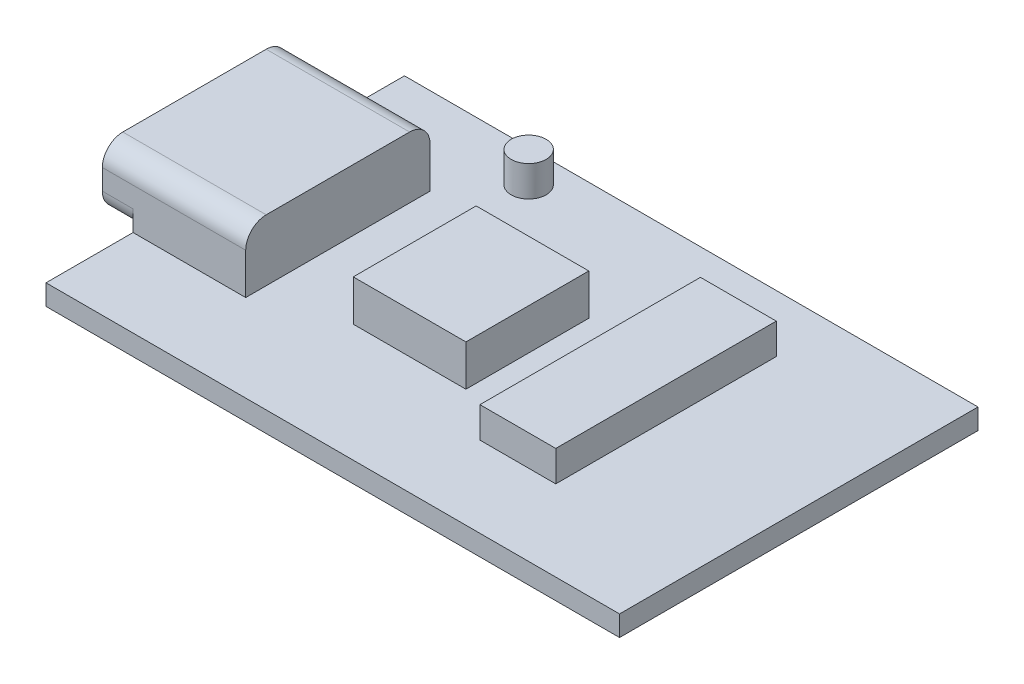
ISO-10303-21;
HEADER;
FILE_DESCRIPTION(('STEP AP214'),'2;1');
FILE_NAME('part.step','',(''),(''),'','','');
FILE_SCHEMA(('AUTOMOTIVE_DESIGN { 1 0 10303 214 1 1 1 1 }'));
ENDSEC;
DATA;
#1=APPLICATION_CONTEXT('core data for automotive mechanical design processes');
#2=APPLICATION_PROTOCOL_DEFINITION('international standard','automotive_design',2000,#1);
#3=PRODUCT_CONTEXT('',#1,'mechanical');
#4=PRODUCT('Part','Part','',(#3));
#5=PRODUCT_RELATED_PRODUCT_CATEGORY('part','',(#4));
#6=PRODUCT_DEFINITION_FORMATION('','',#4);
#7=PRODUCT_DEFINITION_CONTEXT('part definition',#1,'design');
#8=PRODUCT_DEFINITION('design','',#6,#7);
#9=PRODUCT_DEFINITION_SHAPE('','',#8);
#10=(LENGTH_UNIT() NAMED_UNIT(*) SI_UNIT(.MILLI.,.METRE.));
#11=(NAMED_UNIT(*) PLANE_ANGLE_UNIT() SI_UNIT($,.RADIAN.));
#12=(NAMED_UNIT(*) SI_UNIT($,.STERADIAN.) SOLID_ANGLE_UNIT());
#13=UNCERTAINTY_MEASURE_WITH_UNIT(LENGTH_MEASURE(1.E-05),#10,'distance_accuracy_value','');
#14=(GEOMETRIC_REPRESENTATION_CONTEXT(3) GLOBAL_UNCERTAINTY_ASSIGNED_CONTEXT((#13)) GLOBAL_UNIT_ASSIGNED_CONTEXT((#10,
#11,#12)) REPRESENTATION_CONTEXT('',''));
#15=CARTESIAN_POINT('',(0.,0.,0.));
#16=DIRECTION('',(0.,0.,1.));
#17=DIRECTION('',(1.,0.,0.));
#18=AXIS2_PLACEMENT_3D('',#15,#16,#17);
#19=CARTESIAN_POINT('',(0.,1.,0.));
#20=DIRECTION('',(0.,-1.,0.));
#21=DIRECTION('',(0.,0.,-1.));
#22=AXIS2_PLACEMENT_3D('',#19,#20,#21);
#23=PLANE('',#22);
#24=CARTESIAN_POINT('',(-6.36026661886858,1.,-7.17438545371021));
#25=DIRECTION('',(0.,-1.,0.));
#26=DIRECTION('',(0.,0.,-1.));
#27=AXIS2_PLACEMENT_3D('',#24,#25,#26);
#28=CIRCLE('',#27,0.85257989743637);
#29=CARTESIAN_POINT('',(-6.36026661886858,1.,-8.02696535114658));
#30=VERTEX_POINT('',#29);
#31=EDGE_CURVE('E11',#30,#30,#28,.F.);
#32=ORIENTED_EDGE('',*,*,#31,.F.);
#33=EDGE_LOOP('',(#32));
#34=FACE_BOUND('',#33,.T.);
#35=DIRECTION('',(0.,0.,1.));
#36=VECTOR('',#35,1.);
#37=CARTESIAN_POINT('',(-4.75,1.,3.));
#38=LINE('',#37,#36);
#39=CARTESIAN_POINT('',(-4.75,1.,-3.));
#40=VERTEX_POINT('',#39);
#41=CARTESIAN_POINT('',(-4.75,1.,3.));
#42=VERTEX_POINT('',#41);
#43=EDGE_CURVE('E209',#40,#42,#38,.T.);
#44=ORIENTED_EDGE('',*,*,#43,.F.);
#45=DIRECTION('',(-1.,0.,0.));
#46=VECTOR('',#45,1.);
#47=CARTESIAN_POINT('',(0.75,1.,-3.));
#48=LINE('',#47,#46);
#49=CARTESIAN_POINT('',(0.75,1.,-3.));
#50=VERTEX_POINT('',#49);
#51=EDGE_CURVE('E222',#50,#40,#48,.T.);
#52=ORIENTED_EDGE('',*,*,#51,.F.);
#53=DIRECTION('',(0.,0.,-1.));
#54=VECTOR('',#53,1.);
#55=CARTESIAN_POINT('',(0.75,1.,3.));
#56=LINE('',#55,#54);
#57=CARTESIAN_POINT('',(0.75,1.,3.));
#58=VERTEX_POINT('',#57);
#59=EDGE_CURVE('E231',#58,#50,#56,.T.);
#60=ORIENTED_EDGE('',*,*,#59,.F.);
#61=DIRECTION('',(1.,0.,0.));
#62=VECTOR('',#61,1.);
#63=CARTESIAN_POINT('',(0.75,1.,3.));
#64=LINE('',#63,#62);
#65=EDGE_CURVE('E212',#42,#58,#64,.T.);
#66=ORIENTED_EDGE('',*,*,#65,.F.);
#67=EDGE_LOOP('',(#44,#52,#60,#66));
#68=FACE_BOUND('',#67,.T.);
#69=DIRECTION('',(-1.,0.,0.));
#70=VECTOR('',#69,1.);
#71=CARTESIAN_POINT('',(-15.5,1.,-4.5));
#72=LINE('',#71,#70);
#73=CARTESIAN_POINT('',(-8.5,1.,-4.5));
#74=VERTEX_POINT('',#73);
#75=CARTESIAN_POINT('',(-14.,1.,-4.5));
#76=VERTEX_POINT('',#75);
#77=EDGE_CURVE('E252',#74,#76,#72,.T.);
#78=ORIENTED_EDGE('',*,*,#77,.F.);
#79=DIRECTION('',(0.,0.,-1.));
#80=VECTOR('',#79,1.);
#81=CARTESIAN_POINT('',(-8.5,1.,-4.5));
#82=LINE('',#81,#80);
#83=CARTESIAN_POINT('',(-8.5,1.,4.5));
#84=VERTEX_POINT('',#83);
#85=EDGE_CURVE('E258',#84,#74,#82,.T.);
#86=ORIENTED_EDGE('',*,*,#85,.F.);
#87=DIRECTION('',(1.,0.,0.));
#88=VECTOR('',#87,1.);
#89=CARTESIAN_POINT('',(-15.5,1.,4.5));
#90=LINE('',#89,#88);
#91=CARTESIAN_POINT('',(-14.,1.,4.5));
#92=VERTEX_POINT('',#91);
#93=EDGE_CURVE('E259',#92,#84,#90,.T.);
#94=ORIENTED_EDGE('',*,*,#93,.F.);
#95=DIRECTION('',(0.,0.,1.));
#96=VECTOR('',#95,1.);
#97=CARTESIAN_POINT('',(-14.,1.,-8.75));
#98=LINE('',#97,#96);
#99=CARTESIAN_POINT('',(-14.,1.,8.75));
#100=VERTEX_POINT('',#99);
#101=EDGE_CURVE('E283',#92,#100,#98,.T.);
#102=ORIENTED_EDGE('',*,*,#101,.T.);
#103=DIRECTION('',(1.,0.,0.));
#104=VECTOR('',#103,1.);
#105=CARTESIAN_POINT('',(14.,1.,8.75));
#106=LINE('',#105,#104);
#107=CARTESIAN_POINT('',(14.,1.,8.75));
#108=VERTEX_POINT('',#107);
#109=EDGE_CURVE('E281',#100,#108,#106,.T.);
#110=ORIENTED_EDGE('',*,*,#109,.T.);
#111=DIRECTION('',(0.,0.,-1.));
#112=VECTOR('',#111,1.);
#113=CARTESIAN_POINT('',(14.,1.,-8.75));
#114=LINE('',#113,#112);
#115=CARTESIAN_POINT('',(14.,1.,-8.75));
#116=VERTEX_POINT('',#115);
#117=EDGE_CURVE('E285',#108,#116,#114,.T.);
#118=ORIENTED_EDGE('',*,*,#117,.T.);
#119=DIRECTION('',(-1.,0.,0.));
#120=VECTOR('',#119,1.);
#121=CARTESIAN_POINT('',(14.,1.,-8.75));
#122=LINE('',#121,#120);
#123=CARTESIAN_POINT('',(-14.,1.,-8.75));
#124=VERTEX_POINT('',#123);
#125=EDGE_CURVE('E287',#116,#124,#122,.T.);
#126=ORIENTED_EDGE('',*,*,#125,.T.);
#127=EDGE_CURVE('E278',#124,#76,#98,.T.);
#128=ORIENTED_EDGE('',*,*,#127,.T.);
#129=EDGE_LOOP('',(#78,#86,#94,#102,#110,#118,#126,#128));
#130=FACE_BOUND('',#129,.T.);
#131=DIRECTION('',(0.,0.,1.));
#132=VECTOR('',#131,1.);
#133=CARTESIAN_POINT('',(3.2447448176237,1.,-5.9554008218618));
#134=LINE('',#133,#132);
#135=CARTESIAN_POINT('',(3.2447448176237,1.,-5.9554008218618));
#136=VERTEX_POINT('',#135);
#137=CARTESIAN_POINT('',(3.2447448176237,1.,4.8098489991609));
#138=VERTEX_POINT('',#137);
#139=EDGE_CURVE('E208',#136,#138,#134,.T.);
#140=ORIENTED_EDGE('',*,*,#139,.F.);
#141=DIRECTION('',(-1.,0.,0.));
#142=VECTOR('',#141,1.);
#143=CARTESIAN_POINT('',(3.2447448176237,1.,-5.9554008218618));
#144=LINE('',#143,#142);
#145=CARTESIAN_POINT('',(6.94575839865742,1.,-5.9554008218618));
#146=VERTEX_POINT('',#145);
#147=EDGE_CURVE('E205',#146,#136,#144,.T.);
#148=ORIENTED_EDGE('',*,*,#147,.F.);
#149=DIRECTION('',(0.,0.,-1.));
#150=VECTOR('',#149,1.);
#151=CARTESIAN_POINT('',(6.94575839865742,1.,-5.9554008218618));
#152=LINE('',#151,#150);
#153=CARTESIAN_POINT('',(6.94575839865742,1.,4.8098489991609));
#154=VERTEX_POINT('',#153);
#155=EDGE_CURVE('E59',#154,#146,#152,.T.);
#156=ORIENTED_EDGE('',*,*,#155,.F.);
#157=DIRECTION('',(1.,0.,0.));
#158=VECTOR('',#157,1.);
#159=CARTESIAN_POINT('',(3.2447448176237,1.,4.8098489991609));
#160=LINE('',#159,#158);
#161=EDGE_CURVE('E54',#138,#154,#160,.T.);
#162=ORIENTED_EDGE('',*,*,#161,.F.);
#163=EDGE_LOOP('',(#140,#148,#156,#162));
#164=FACE_BOUND('',#163,.T.);
#165=ADVANCED_FACE('F39',(#34,#68,#130,#164),#23,.F.);
#166=CARTESIAN_POINT('',(-14.,1.,-8.75));
#167=DIRECTION('',(1.,0.,0.));
#168=DIRECTION('',(0.,0.,-1.));
#169=AXIS2_PLACEMENT_3D('',#166,#167,#168);
#170=PLANE('',#169);
#171=DIRECTION('',(0.,0.,1.));
#172=VECTOR('',#171,1.);
#173=CARTESIAN_POINT('',(-14.,0.,-8.75));
#174=LINE('',#173,#172);
#175=CARTESIAN_POINT('',(-14.,0.,-8.75));
#176=VERTEX_POINT('',#175);
#177=CARTESIAN_POINT('',(-14.,0.,8.75));
#178=VERTEX_POINT('',#177);
#179=EDGE_CURVE('E277',#176,#178,#174,.T.);
#180=ORIENTED_EDGE('',*,*,#179,.T.);
#181=DIRECTION('',(0.,-1.,0.));
#182=VECTOR('',#181,1.);
#183=CARTESIAN_POINT('',(-14.,1.,8.75));
#184=LINE('',#183,#182);
#185=EDGE_CURVE('E263',#100,#178,#184,.T.);
#186=ORIENTED_EDGE('',*,*,#185,.F.);
#187=ORIENTED_EDGE('',*,*,#101,.F.);
#188=DIRECTION('',(0.,-1.,0.));
#189=VECTOR('',#188,1.);
#190=CARTESIAN_POINT('',(-14.,4.,4.5));
#191=LINE('',#190,#189);
#192=CARTESIAN_POINT('',(-14.,2.,4.5));
#193=VERTEX_POINT('',#192);
#194=EDGE_CURVE('E329',#193,#92,#191,.T.);
#195=ORIENTED_EDGE('',*,*,#194,.F.);
#196=CARTESIAN_POINT('',(-14.,2.,3.5));
#197=DIRECTION('',(1.,0.,0.));
#198=DIRECTION('',(0.,0.,-1.));
#199=AXIS2_PLACEMENT_3D('',#196,#197,#198);
#200=CIRCLE('',#199,1.);
#201=CARTESIAN_POINT('',(-14.,1.,3.5));
#202=VERTEX_POINT('',#201);
#203=EDGE_CURVE('E47',#193,#202,#200,.T.);
#204=ORIENTED_EDGE('',*,*,#203,.T.);
#205=CARTESIAN_POINT('',(-14.,1.,-3.5));
#206=VERTEX_POINT('',#205);
#207=EDGE_CURVE('E282',#206,#202,#98,.T.);
#208=ORIENTED_EDGE('',*,*,#207,.F.);
#209=CARTESIAN_POINT('',(-14.,2.,-3.5));
#210=DIRECTION('',(1.,0.,0.));
#211=DIRECTION('',(0.,0.,-1.));
#212=AXIS2_PLACEMENT_3D('',#209,#210,#211);
#213=CIRCLE('',#212,1.);
#214=CARTESIAN_POINT('',(-14.,2.,-4.5));
#215=VERTEX_POINT('',#214);
#216=EDGE_CURVE('E344',#206,#215,#213,.T.);
#217=ORIENTED_EDGE('',*,*,#216,.T.);
#218=DIRECTION('',(0.,1.,0.));
#219=VECTOR('',#218,1.);
#220=CARTESIAN_POINT('',(-14.,4.,-4.5));
#221=LINE('',#220,#219);
#222=EDGE_CURVE('E309',#76,#215,#221,.T.);
#223=ORIENTED_EDGE('',*,*,#222,.F.);
#224=ORIENTED_EDGE('',*,*,#127,.F.);
#225=DIRECTION('',(0.,-1.,0.));
#226=VECTOR('',#225,1.);
#227=CARTESIAN_POINT('',(-14.,1.,-8.75));
#228=LINE('',#227,#226);
#229=EDGE_CURVE('E289',#124,#176,#228,.T.);
#230=ORIENTED_EDGE('',*,*,#229,.T.);
#231=EDGE_LOOP('',(#180,#186,#187,#195,#204,#208,#217,#223,#224,#230));
#232=FACE_BOUND('',#231,.T.);
#233=ADVANCED_FACE('F349',(#232),#170,.F.);
#234=CARTESIAN_POINT('',(14.,1.,8.75));
#235=DIRECTION('',(0.,0.,-1.));
#236=DIRECTION('',(-1.,0.,0.));
#237=AXIS2_PLACEMENT_3D('',#234,#235,#236);
#238=PLANE('',#237);
#239=DIRECTION('',(1.,0.,0.));
#240=VECTOR('',#239,1.);
#241=CARTESIAN_POINT('',(14.,0.,8.75));
#242=LINE('',#241,#240);
#243=CARTESIAN_POINT('',(14.,0.,8.75));
#244=VERTEX_POINT('',#243);
#245=EDGE_CURVE('E292',#178,#244,#242,.T.);
#246=ORIENTED_EDGE('',*,*,#245,.T.);
#247=DIRECTION('',(0.,-1.,0.));
#248=VECTOR('',#247,1.);
#249=CARTESIAN_POINT('',(14.,1.,8.75));
#250=LINE('',#249,#248);
#251=EDGE_CURVE('E303',#108,#244,#250,.T.);
#252=ORIENTED_EDGE('',*,*,#251,.F.);
#253=ORIENTED_EDGE('',*,*,#109,.F.);
#254=ORIENTED_EDGE('',*,*,#185,.T.);
#255=EDGE_LOOP('',(#246,#252,#253,#254));
#256=FACE_BOUND('',#255,.T.);
#257=ADVANCED_FACE('F406',(#256),#238,.F.);
#258=CARTESIAN_POINT('',(14.,1.,-8.75));
#259=DIRECTION('',(-1.,0.,0.));
#260=DIRECTION('',(0.,0.,1.));
#261=AXIS2_PLACEMENT_3D('',#258,#259,#260);
#262=PLANE('',#261);
#263=DIRECTION('',(0.,0.,-1.));
#264=VECTOR('',#263,1.);
#265=CARTESIAN_POINT('',(14.,0.,-8.75));
#266=LINE('',#265,#264);
#267=CARTESIAN_POINT('',(14.,0.,-8.75));
#268=VERTEX_POINT('',#267);
#269=EDGE_CURVE('E294',#244,#268,#266,.T.);
#270=ORIENTED_EDGE('',*,*,#269,.T.);
#271=DIRECTION('',(0.,-1.,0.));
#272=VECTOR('',#271,1.);
#273=CARTESIAN_POINT('',(14.,1.,-8.75));
#274=LINE('',#273,#272);
#275=EDGE_CURVE('E300',#116,#268,#274,.T.);
#276=ORIENTED_EDGE('',*,*,#275,.F.);
#277=ORIENTED_EDGE('',*,*,#117,.F.);
#278=ORIENTED_EDGE('',*,*,#251,.T.);
#279=EDGE_LOOP('',(#270,#276,#277,#278));
#280=FACE_BOUND('',#279,.T.);
#281=ADVANCED_FACE('F433',(#280),#262,.F.);
#282=CARTESIAN_POINT('',(14.,1.,-8.75));
#283=DIRECTION('',(0.,0.,1.));
#284=DIRECTION('',(1.,0.,0.));
#285=AXIS2_PLACEMENT_3D('',#282,#283,#284);
#286=PLANE('',#285);
#287=DIRECTION('',(-1.,0.,0.));
#288=VECTOR('',#287,1.);
#289=CARTESIAN_POINT('',(14.,0.,-8.75));
#290=LINE('',#289,#288);
#291=EDGE_CURVE('E296',#268,#176,#290,.T.);
#292=ORIENTED_EDGE('',*,*,#291,.T.);
#293=ORIENTED_EDGE('',*,*,#229,.F.);
#294=ORIENTED_EDGE('',*,*,#125,.F.);
#295=ORIENTED_EDGE('',*,*,#275,.T.);
#296=EDGE_LOOP('',(#292,#293,#294,#295));
#297=FACE_BOUND('',#296,.T.);
#298=ADVANCED_FACE('F396',(#297),#286,.F.);
#299=CARTESIAN_POINT('',(0.,0.,0.));
#300=DIRECTION('',(0.,-1.,0.));
#301=DIRECTION('',(0.,0.,-1.));
#302=AXIS2_PLACEMENT_3D('',#299,#300,#301);
#303=PLANE('',#302);
#304=ORIENTED_EDGE('',*,*,#179,.F.);
#305=ORIENTED_EDGE('',*,*,#291,.F.);
#306=ORIENTED_EDGE('',*,*,#269,.F.);
#307=ORIENTED_EDGE('',*,*,#245,.F.);
#308=EDGE_LOOP('',(#304,#305,#306,#307));
#309=FACE_BOUND('',#308,.T.);
#310=ADVANCED_FACE('F401',(#309),#303,.T.);
#311=CARTESIAN_POINT('',(0.,1.,0.));
#312=DIRECTION('',(0.,1.,0.));
#313=DIRECTION('',(0.,0.,1.));
#314=AXIS2_PLACEMENT_3D('',#311,#312,#313);
#315=PLANE('',#314);
#316=DIRECTION('',(0.,0.,1.));
#317=VECTOR('',#316,1.);
#318=CARTESIAN_POINT('',(-15.5,1.,-4.5));
#319=LINE('',#318,#317);
#320=CARTESIAN_POINT('',(-15.5,1.,-3.5));
#321=VERTEX_POINT('',#320);
#322=CARTESIAN_POINT('',(-15.5,1.,3.5));
#323=VERTEX_POINT('',#322);
#324=EDGE_CURVE('E247',#321,#323,#319,.T.);
#325=ORIENTED_EDGE('',*,*,#324,.F.);
#326=DIRECTION('',(-1.,0.,0.));
#327=VECTOR('',#326,1.);
#328=CARTESIAN_POINT('',(0.,1.,-3.5));
#329=LINE('',#328,#327);
#330=EDGE_CURVE('E325',#321,#206,#329,.F.);
#331=ORIENTED_EDGE('',*,*,#330,.T.);
#332=ORIENTED_EDGE('',*,*,#207,.T.);
#333=DIRECTION('',(1.,0.,0.));
#334=VECTOR('',#333,1.);
#335=CARTESIAN_POINT('',(0.,1.,3.5));
#336=LINE('',#335,#334);
#337=EDGE_CURVE('E323',#202,#323,#336,.F.);
#338=ORIENTED_EDGE('',*,*,#337,.T.);
#339=EDGE_LOOP('',(#325,#331,#332,#338));
#340=FACE_BOUND('',#339,.T.);
#341=ADVANCED_FACE('F357',(#340),#315,.F.);
#342=CARTESIAN_POINT('',(-15.5,4.,-4.5));
#343=DIRECTION('',(1.,0.,0.));
#344=DIRECTION('',(0.,0.,-1.));
#345=AXIS2_PLACEMENT_3D('',#342,#343,#344);
#346=PLANE('',#345);
#347=DIRECTION('',(0.,-1.,0.));
#348=VECTOR('',#347,1.);
#349=CARTESIAN_POINT('',(-15.5,4.,-4.5));
#350=LINE('',#349,#348);
#351=CARTESIAN_POINT('',(-15.5,3.,-4.5));
#352=VERTEX_POINT('',#351);
#353=CARTESIAN_POINT('',(-15.5,2.,-4.5));
#354=VERTEX_POINT('',#353);
#355=EDGE_CURVE('E255',#352,#354,#350,.T.);
#356=ORIENTED_EDGE('',*,*,#355,.T.);
#357=CARTESIAN_POINT('',(-15.5,2.,-3.5));
#358=DIRECTION('',(1.,0.,0.));
#359=DIRECTION('',(0.,0.,-1.));
#360=AXIS2_PLACEMENT_3D('',#357,#358,#359);
#361=CIRCLE('',#360,1.);
#362=EDGE_CURVE('E321',#354,#321,#361,.F.);
#363=ORIENTED_EDGE('',*,*,#362,.T.);
#364=ORIENTED_EDGE('',*,*,#324,.T.);
#365=CARTESIAN_POINT('',(-15.5,2.,3.5));
#366=DIRECTION('',(1.,0.,0.));
#367=DIRECTION('',(0.,0.,-1.));
#368=AXIS2_PLACEMENT_3D('',#365,#366,#367);
#369=CIRCLE('',#368,1.);
#370=CARTESIAN_POINT('',(-15.5,2.,4.5));
#371=VERTEX_POINT('',#370);
#372=EDGE_CURVE('E319',#323,#371,#369,.F.);
#373=ORIENTED_EDGE('',*,*,#372,.T.);
#374=DIRECTION('',(0.,-1.,0.));
#375=VECTOR('',#374,1.);
#376=CARTESIAN_POINT('',(-15.5,4.,4.5));
#377=LINE('',#376,#375);
#378=CARTESIAN_POINT('',(-15.5,3.,4.5));
#379=VERTEX_POINT('',#378);
#380=EDGE_CURVE('E274',#379,#371,#377,.T.);
#381=ORIENTED_EDGE('',*,*,#380,.F.);
#382=CARTESIAN_POINT('',(-15.5,3.,3.5));
#383=DIRECTION('',(1.,0.,0.));
#384=DIRECTION('',(0.,0.,-1.));
#385=AXIS2_PLACEMENT_3D('',#382,#383,#384);
#386=CIRCLE('',#385,1.);
#387=CARTESIAN_POINT('',(-15.5,4.,3.5));
#388=VERTEX_POINT('',#387);
#389=EDGE_CURVE('E315',#379,#388,#386,.F.);
#390=ORIENTED_EDGE('',*,*,#389,.T.);
#391=DIRECTION('',(0.,0.,1.));
#392=VECTOR('',#391,1.);
#393=CARTESIAN_POINT('',(-15.5,4.,-4.5));
#394=LINE('',#393,#392);
#395=CARTESIAN_POINT('',(-15.5,4.,-3.5));
#396=VERTEX_POINT('',#395);
#397=EDGE_CURVE('E248',#396,#388,#394,.T.);
#398=ORIENTED_EDGE('',*,*,#397,.F.);
#399=CARTESIAN_POINT('',(-15.5,3.,-3.5));
#400=DIRECTION('',(1.,0.,0.));
#401=DIRECTION('',(0.,0.,-1.));
#402=AXIS2_PLACEMENT_3D('',#399,#400,#401);
#403=CIRCLE('',#402,1.);
#404=EDGE_CURVE('E317',#396,#352,#403,.F.);
#405=ORIENTED_EDGE('',*,*,#404,.T.);
#406=EDGE_LOOP('',(#356,#363,#364,#373,#381,#390,#398,#405));
#407=FACE_BOUND('',#406,.T.);
#408=ADVANCED_FACE('F363',(#407),#346,.F.);
#409=CARTESIAN_POINT('',(-15.5,4.,4.5));
#410=DIRECTION('',(0.,0.,-1.));
#411=DIRECTION('',(-1.,0.,0.));
#412=AXIS2_PLACEMENT_3D('',#409,#410,#411);
#413=PLANE('',#412);
#414=ORIENTED_EDGE('',*,*,#380,.T.);
#415=DIRECTION('',(1.,0.,0.));
#416=VECTOR('',#415,1.);
#417=CARTESIAN_POINT('',(-15.5,2.,4.5));
#418=LINE('',#417,#416);
#419=EDGE_CURVE('E331',#371,#193,#418,.T.);
#420=ORIENTED_EDGE('',*,*,#419,.T.);
#421=ORIENTED_EDGE('',*,*,#194,.T.);
#422=ORIENTED_EDGE('',*,*,#93,.T.);
#423=DIRECTION('',(0.,-1.,0.));
#424=VECTOR('',#423,1.);
#425=CARTESIAN_POINT('',(-8.5,4.,4.5));
#426=LINE('',#425,#424);
#427=CARTESIAN_POINT('',(-8.5,3.,4.5));
#428=VERTEX_POINT('',#427);
#429=EDGE_CURVE('E272',#428,#84,#426,.T.);
#430=ORIENTED_EDGE('',*,*,#429,.F.);
#431=DIRECTION('',(1.,0.,0.));
#432=VECTOR('',#431,1.);
#433=CARTESIAN_POINT('',(-15.5,3.,4.5));
#434=LINE('',#433,#432);
#435=EDGE_CURVE('E327',#428,#379,#434,.F.);
#436=ORIENTED_EDGE('',*,*,#435,.T.);
#437=EDGE_LOOP('',(#414,#420,#421,#422,#430,#436));
#438=FACE_BOUND('',#437,.T.);
#439=ADVANCED_FACE('F366',(#438),#413,.F.);
#440=CARTESIAN_POINT('',(-8.5,4.,-4.5));
#441=DIRECTION('',(-1.,0.,0.));
#442=DIRECTION('',(0.,0.,1.));
#443=AXIS2_PLACEMENT_3D('',#440,#441,#442);
#444=PLANE('',#443);
#445=DIRECTION('',(0.,-1.,0.));
#446=VECTOR('',#445,1.);
#447=CARTESIAN_POINT('',(-8.5,4.,-4.5));
#448=LINE('',#447,#446);
#449=CARTESIAN_POINT('',(-8.5,3.,-4.5));
#450=VERTEX_POINT('',#449);
#451=EDGE_CURVE('E270',#450,#74,#448,.T.);
#452=ORIENTED_EDGE('',*,*,#451,.F.);
#453=CARTESIAN_POINT('',(-8.5,3.,-3.5));
#454=DIRECTION('',(-1.,0.,0.));
#455=DIRECTION('',(0.,0.,1.));
#456=AXIS2_PLACEMENT_3D('',#453,#454,#455);
#457=CIRCLE('',#456,1.);
#458=CARTESIAN_POINT('',(-8.5,4.,-3.5));
#459=VERTEX_POINT('',#458);
#460=EDGE_CURVE('E342',#450,#459,#457,.F.);
#461=ORIENTED_EDGE('',*,*,#460,.T.);
#462=DIRECTION('',(0.,0.,-1.));
#463=VECTOR('',#462,1.);
#464=CARTESIAN_POINT('',(-8.5,4.,-4.5));
#465=LINE('',#464,#463);
#466=CARTESIAN_POINT('',(-8.5,4.,3.5));
#467=VERTEX_POINT('',#466);
#468=EDGE_CURVE('E251',#467,#459,#465,.T.);
#469=ORIENTED_EDGE('',*,*,#468,.F.);
#470=CARTESIAN_POINT('',(-8.5,3.,3.5));
#471=DIRECTION('',(-1.,0.,0.));
#472=DIRECTION('',(0.,0.,1.));
#473=AXIS2_PLACEMENT_3D('',#470,#471,#472);
#474=CIRCLE('',#473,1.);
#475=EDGE_CURVE('E340',#467,#428,#474,.F.);
#476=ORIENTED_EDGE('',*,*,#475,.T.);
#477=ORIENTED_EDGE('',*,*,#429,.T.);
#478=ORIENTED_EDGE('',*,*,#85,.T.);
#479=EDGE_LOOP('',(#452,#461,#469,#476,#477,#478));
#480=FACE_BOUND('',#479,.T.);
#481=ADVANCED_FACE('F409',(#480),#444,.F.);
#482=CARTESIAN_POINT('',(-15.5,4.,-4.5));
#483=DIRECTION('',(0.,0.,1.));
#484=DIRECTION('',(1.,0.,0.));
#485=AXIS2_PLACEMENT_3D('',#482,#483,#484);
#486=PLANE('',#485);
#487=ORIENTED_EDGE('',*,*,#222,.T.);
#488=DIRECTION('',(-1.,0.,0.));
#489=VECTOR('',#488,1.);
#490=CARTESIAN_POINT('',(-15.5,2.,-4.5));
#491=LINE('',#490,#489);
#492=EDGE_CURVE('E312',#215,#354,#491,.T.);
#493=ORIENTED_EDGE('',*,*,#492,.T.);
#494=ORIENTED_EDGE('',*,*,#355,.F.);
#495=DIRECTION('',(-1.,0.,0.));
#496=VECTOR('',#495,1.);
#497=CARTESIAN_POINT('',(-8.5,3.,-4.5));
#498=LINE('',#497,#496);
#499=EDGE_CURVE('E262',#352,#450,#498,.F.);
#500=ORIENTED_EDGE('',*,*,#499,.T.);
#501=ORIENTED_EDGE('',*,*,#451,.T.);
#502=ORIENTED_EDGE('',*,*,#77,.T.);
#503=EDGE_LOOP('',(#487,#493,#494,#500,#501,#502));
#504=FACE_BOUND('',#503,.T.);
#505=ADVANCED_FACE('F382',(#504),#486,.F.);
#506=CARTESIAN_POINT('',(0.,4.,0.));
#507=DIRECTION('',(0.,1.,0.));
#508=DIRECTION('',(0.,0.,1.));
#509=AXIS2_PLACEMENT_3D('',#506,#507,#508);
#510=PLANE('',#509);
#511=ORIENTED_EDGE('',*,*,#468,.T.);
#512=DIRECTION('',(-1.,0.,0.));
#513=VECTOR('',#512,1.);
#514=CARTESIAN_POINT('',(-15.5,4.,-3.5));
#515=LINE('',#514,#513);
#516=EDGE_CURVE('E337',#459,#396,#515,.T.);
#517=ORIENTED_EDGE('',*,*,#516,.T.);
#518=ORIENTED_EDGE('',*,*,#397,.T.);
#519=DIRECTION('',(1.,0.,0.));
#520=VECTOR('',#519,1.);
#521=CARTESIAN_POINT('',(-8.5,4.,3.5));
#522=LINE('',#521,#520);
#523=EDGE_CURVE('E334',#388,#467,#522,.T.);
#524=ORIENTED_EDGE('',*,*,#523,.T.);
#525=EDGE_LOOP('',(#511,#517,#518,#524));
#526=FACE_BOUND('',#525,.T.);
#527=ADVANCED_FACE('F373',(#526),#510,.T.);
#528=CARTESIAN_POINT('',(-15.5,2.,-3.5));
#529=DIRECTION('',(-1.,0.,0.));
#530=DIRECTION('',(0.,0.,1.));
#531=AXIS2_PLACEMENT_3D('',#528,#529,#530);
#532=CYLINDRICAL_SURFACE('',#531,1.);
#533=ORIENTED_EDGE('',*,*,#216,.F.);
#534=ORIENTED_EDGE('',*,*,#330,.F.);
#535=ORIENTED_EDGE('',*,*,#362,.F.);
#536=ORIENTED_EDGE('',*,*,#492,.F.);
#537=EDGE_LOOP('',(#533,#534,#535,#536));
#538=FACE_BOUND('',#537,.T.);
#539=ADVANCED_FACE('F386',(#538),#532,.T.);
#540=CARTESIAN_POINT('',(-15.5,2.,3.5));
#541=DIRECTION('',(1.,0.,0.));
#542=DIRECTION('',(0.,0.,-1.));
#543=AXIS2_PLACEMENT_3D('',#540,#541,#542);
#544=CYLINDRICAL_SURFACE('',#543,1.);
#545=ORIENTED_EDGE('',*,*,#372,.F.);
#546=ORIENTED_EDGE('',*,*,#337,.F.);
#547=ORIENTED_EDGE('',*,*,#203,.F.);
#548=ORIENTED_EDGE('',*,*,#419,.F.);
#549=EDGE_LOOP('',(#545,#546,#547,#548));
#550=FACE_BOUND('',#549,.T.);
#551=ADVANCED_FACE('F360',(#550),#544,.T.);
#552=CARTESIAN_POINT('',(0.,3.,-3.5));
#553=DIRECTION('',(1.,0.,0.));
#554=DIRECTION('',(0.,0.,-1.));
#555=AXIS2_PLACEMENT_3D('',#552,#553,#554);
#556=CYLINDRICAL_SURFACE('',#555,1.);
#557=ORIENTED_EDGE('',*,*,#460,.F.);
#558=ORIENTED_EDGE('',*,*,#499,.F.);
#559=ORIENTED_EDGE('',*,*,#404,.F.);
#560=ORIENTED_EDGE('',*,*,#516,.F.);
#561=EDGE_LOOP('',(#557,#558,#559,#560));
#562=FACE_BOUND('',#561,.T.);
#563=ADVANCED_FACE('F378',(#562),#556,.T.);
#564=CARTESIAN_POINT('',(0.,3.,3.5));
#565=DIRECTION('',(-1.,0.,0.));
#566=DIRECTION('',(0.,0.,1.));
#567=AXIS2_PLACEMENT_3D('',#564,#565,#566);
#568=CYLINDRICAL_SURFACE('',#567,1.);
#569=ORIENTED_EDGE('',*,*,#389,.F.);
#570=ORIENTED_EDGE('',*,*,#435,.F.);
#571=ORIENTED_EDGE('',*,*,#475,.F.);
#572=ORIENTED_EDGE('',*,*,#523,.F.);
#573=EDGE_LOOP('',(#569,#570,#571,#572));
#574=FACE_BOUND('',#573,.T.);
#575=ADVANCED_FACE('F41',(#574),#568,.T.);
#576=CARTESIAN_POINT('',(-4.75,3.,3.));
#577=DIRECTION('',(1.,0.,0.));
#578=DIRECTION('',(0.,0.,-1.));
#579=AXIS2_PLACEMENT_3D('',#576,#577,#578);
#580=PLANE('',#579);
#581=ORIENTED_EDGE('',*,*,#43,.T.);
#582=DIRECTION('',(0.,-1.,0.));
#583=VECTOR('',#582,1.);
#584=CARTESIAN_POINT('',(-4.75,3.,3.));
#585=LINE('',#584,#583);
#586=CARTESIAN_POINT('',(-4.75,3.,3.));
#587=VERTEX_POINT('',#586);
#588=EDGE_CURVE('E244',#587,#42,#585,.T.);
#589=ORIENTED_EDGE('',*,*,#588,.F.);
#590=DIRECTION('',(0.,0.,1.));
#591=VECTOR('',#590,1.);
#592=CARTESIAN_POINT('',(-4.75,3.,3.));
#593=LINE('',#592,#591);
#594=CARTESIAN_POINT('',(-4.75,3.,-3.));
#595=VERTEX_POINT('',#594);
#596=EDGE_CURVE('E218',#595,#587,#593,.T.);
#597=ORIENTED_EDGE('',*,*,#596,.F.);
#598=DIRECTION('',(0.,-1.,0.));
#599=VECTOR('',#598,1.);
#600=CARTESIAN_POINT('',(-4.75,3.,-3.));
#601=LINE('',#600,#599);
#602=EDGE_CURVE('E227',#595,#40,#601,.T.);
#603=ORIENTED_EDGE('',*,*,#602,.T.);
#604=EDGE_LOOP('',(#581,#589,#597,#603));
#605=FACE_BOUND('',#604,.T.);
#606=ADVANCED_FACE('F446',(#605),#580,.F.);
#607=CARTESIAN_POINT('',(0.75,3.,3.));
#608=DIRECTION('',(0.,0.,-1.));
#609=DIRECTION('',(-1.,0.,0.));
#610=AXIS2_PLACEMENT_3D('',#607,#608,#609);
#611=PLANE('',#610);
#612=ORIENTED_EDGE('',*,*,#65,.T.);
#613=DIRECTION('',(0.,-1.,0.));
#614=VECTOR('',#613,1.);
#615=CARTESIAN_POINT('',(0.75,3.,3.));
#616=LINE('',#615,#614);
#617=CARTESIAN_POINT('',(0.75,3.,3.));
#618=VERTEX_POINT('',#617);
#619=EDGE_CURVE('E241',#618,#58,#616,.T.);
#620=ORIENTED_EDGE('',*,*,#619,.F.);
#621=DIRECTION('',(1.,0.,0.));
#622=VECTOR('',#621,1.);
#623=CARTESIAN_POINT('',(0.75,3.,3.));
#624=LINE('',#623,#622);
#625=EDGE_CURVE('E221',#587,#618,#624,.T.);
#626=ORIENTED_EDGE('',*,*,#625,.F.);
#627=ORIENTED_EDGE('',*,*,#588,.T.);
#628=EDGE_LOOP('',(#612,#620,#626,#627));
#629=FACE_BOUND('',#628,.T.);
#630=ADVANCED_FACE('F450',(#629),#611,.F.);
#631=CARTESIAN_POINT('',(0.75,3.,3.));
#632=DIRECTION('',(-1.,0.,0.));
#633=DIRECTION('',(0.,0.,1.));
#634=AXIS2_PLACEMENT_3D('',#631,#632,#633);
#635=PLANE('',#634);
#636=ORIENTED_EDGE('',*,*,#59,.T.);
#637=DIRECTION('',(0.,-1.,0.));
#638=VECTOR('',#637,1.);
#639=CARTESIAN_POINT('',(0.75,3.,-3.));
#640=LINE('',#639,#638);
#641=CARTESIAN_POINT('',(0.75,3.,-3.));
#642=VERTEX_POINT('',#641);
#643=EDGE_CURVE('E238',#642,#50,#640,.T.);
#644=ORIENTED_EDGE('',*,*,#643,.F.);
#645=DIRECTION('',(0.,0.,-1.));
#646=VECTOR('',#645,1.);
#647=CARTESIAN_POINT('',(0.75,3.,3.));
#648=LINE('',#647,#646);
#649=EDGE_CURVE('E224',#618,#642,#648,.T.);
#650=ORIENTED_EDGE('',*,*,#649,.F.);
#651=ORIENTED_EDGE('',*,*,#619,.T.);
#652=EDGE_LOOP('',(#636,#644,#650,#651));
#653=FACE_BOUND('',#652,.T.);
#654=ADVANCED_FACE('F456',(#653),#635,.F.);
#655=CARTESIAN_POINT('',(0.75,3.,-3.));
#656=DIRECTION('',(0.,0.,1.));
#657=DIRECTION('',(1.,0.,0.));
#658=AXIS2_PLACEMENT_3D('',#655,#656,#657);
#659=PLANE('',#658);
#660=ORIENTED_EDGE('',*,*,#51,.T.);
#661=ORIENTED_EDGE('',*,*,#602,.F.);
#662=DIRECTION('',(-1.,0.,0.));
#663=VECTOR('',#662,1.);
#664=CARTESIAN_POINT('',(0.75,3.,-3.));
#665=LINE('',#664,#663);
#666=EDGE_CURVE('E226',#642,#595,#665,.T.);
#667=ORIENTED_EDGE('',*,*,#666,.F.);
#668=ORIENTED_EDGE('',*,*,#643,.T.);
#669=EDGE_LOOP('',(#660,#661,#667,#668));
#670=FACE_BOUND('',#669,.T.);
#671=ADVANCED_FACE('F538',(#670),#659,.F.);
#672=CARTESIAN_POINT('',(0.,3.,0.));
#673=DIRECTION('',(0.,1.,0.));
#674=DIRECTION('',(0.,0.,1.));
#675=AXIS2_PLACEMENT_3D('',#672,#673,#674);
#676=PLANE('',#675);
#677=ORIENTED_EDGE('',*,*,#596,.T.);
#678=ORIENTED_EDGE('',*,*,#625,.T.);
#679=ORIENTED_EDGE('',*,*,#649,.T.);
#680=ORIENTED_EDGE('',*,*,#666,.T.);
#681=EDGE_LOOP('',(#677,#678,#679,#680));
#682=FACE_BOUND('',#681,.T.);
#683=ADVANCED_FACE('F548',(#682),#676,.T.);
#684=CARTESIAN_POINT('',(3.2447448176237,2.5,-5.9554008218618));
#685=DIRECTION('',(1.,0.,0.));
#686=DIRECTION('',(0.,0.,-1.));
#687=AXIS2_PLACEMENT_3D('',#684,#685,#686);
#688=PLANE('',#687);
#689=ORIENTED_EDGE('',*,*,#139,.T.);
#690=DIRECTION('',(0.,-1.,0.));
#691=VECTOR('',#690,1.);
#692=CARTESIAN_POINT('',(3.2447448176237,2.5,4.8098489991609));
#693=LINE('',#692,#691);
#694=CARTESIAN_POINT('',(3.2447448176237,2.5,4.8098489991609));
#695=VERTEX_POINT('',#694);
#696=EDGE_CURVE('E189',#695,#138,#693,.T.);
#697=ORIENTED_EDGE('',*,*,#696,.F.);
#698=DIRECTION('',(0.,0.,1.));
#699=VECTOR('',#698,1.);
#700=CARTESIAN_POINT('',(3.2447448176237,2.5,-5.9554008218618));
#701=LINE('',#700,#699);
#702=CARTESIAN_POINT('',(3.2447448176237,2.5,-5.9554008218618));
#703=VERTEX_POINT('',#702);
#704=EDGE_CURVE('E196',#703,#695,#701,.T.);
#705=ORIENTED_EDGE('',*,*,#704,.F.);
#706=DIRECTION('',(0.,-1.,0.));
#707=VECTOR('',#706,1.);
#708=CARTESIAN_POINT('',(3.2447448176237,2.5,-5.9554008218618));
#709=LINE('',#708,#707);
#710=EDGE_CURVE('E662',#703,#136,#709,.T.);
#711=ORIENTED_EDGE('',*,*,#710,.T.);
#712=EDGE_LOOP('',(#689,#697,#705,#711));
#713=FACE_BOUND('',#712,.T.);
#714=ADVANCED_FACE('F207',(#713),#688,.F.);
#715=CARTESIAN_POINT('',(3.2447448176237,2.5,4.8098489991609));
#716=DIRECTION('',(0.,0.,-1.));
#717=DIRECTION('',(-1.,0.,0.));
#718=AXIS2_PLACEMENT_3D('',#715,#716,#717);
#719=PLANE('',#718);
#720=ORIENTED_EDGE('',*,*,#161,.T.);
#721=DIRECTION('',(0.,-1.,0.));
#722=VECTOR('',#721,1.);
#723=CARTESIAN_POINT('',(6.94575839865742,2.5,4.8098489991609));
#724=LINE('',#723,#722);
#725=CARTESIAN_POINT('',(6.94575839865742,2.5,4.8098489991609));
#726=VERTEX_POINT('',#725);
#727=EDGE_CURVE('E192',#726,#154,#724,.T.);
#728=ORIENTED_EDGE('',*,*,#727,.F.);
#729=DIRECTION('',(1.,0.,0.));
#730=VECTOR('',#729,1.);
#731=CARTESIAN_POINT('',(3.2447448176237,2.5,4.8098489991609));
#732=LINE('',#731,#730);
#733=EDGE_CURVE('E185',#695,#726,#732,.T.);
#734=ORIENTED_EDGE('',*,*,#733,.F.);
#735=ORIENTED_EDGE('',*,*,#696,.T.);
#736=EDGE_LOOP('',(#720,#728,#734,#735));
#737=FACE_BOUND('',#736,.T.);
#738=ADVANCED_FACE('F187',(#737),#719,.F.);
#739=CARTESIAN_POINT('',(6.94575839865742,2.5,-5.9554008218618));
#740=DIRECTION('',(-1.,0.,0.));
#741=DIRECTION('',(0.,0.,1.));
#742=AXIS2_PLACEMENT_3D('',#739,#740,#741);
#743=PLANE('',#742);
#744=ORIENTED_EDGE('',*,*,#155,.T.);
#745=DIRECTION('',(0.,-1.,0.));
#746=VECTOR('',#745,1.);
#747=CARTESIAN_POINT('',(6.94575839865742,2.5,-5.9554008218618));
#748=LINE('',#747,#746);
#749=CARTESIAN_POINT('',(6.94575839865742,2.5,-5.9554008218618));
#750=VERTEX_POINT('',#749);
#751=EDGE_CURVE('E214',#750,#146,#748,.T.);
#752=ORIENTED_EDGE('',*,*,#751,.F.);
#753=DIRECTION('',(0.,0.,-1.));
#754=VECTOR('',#753,1.);
#755=CARTESIAN_POINT('',(6.94575839865742,2.5,-5.9554008218618));
#756=LINE('',#755,#754);
#757=EDGE_CURVE('E195',#726,#750,#756,.T.);
#758=ORIENTED_EDGE('',*,*,#757,.F.);
#759=ORIENTED_EDGE('',*,*,#727,.T.);
#760=EDGE_LOOP('',(#744,#752,#758,#759));
#761=FACE_BOUND('',#760,.T.);
#762=ADVANCED_FACE('F590',(#761),#743,.F.);
#763=CARTESIAN_POINT('',(3.2447448176237,2.5,-5.9554008218618));
#764=DIRECTION('',(0.,0.,1.));
#765=DIRECTION('',(1.,0.,0.));
#766=AXIS2_PLACEMENT_3D('',#763,#764,#765);
#767=PLANE('',#766);
#768=ORIENTED_EDGE('',*,*,#147,.T.);
#769=ORIENTED_EDGE('',*,*,#710,.F.);
#770=DIRECTION('',(-1.,0.,0.));
#771=VECTOR('',#770,1.);
#772=CARTESIAN_POINT('',(3.2447448176237,2.5,-5.9554008218618));
#773=LINE('',#772,#771);
#774=EDGE_CURVE('E201',#750,#703,#773,.T.);
#775=ORIENTED_EDGE('',*,*,#774,.F.);
#776=ORIENTED_EDGE('',*,*,#751,.T.);
#777=EDGE_LOOP('',(#768,#769,#775,#776));
#778=FACE_BOUND('',#777,.T.);
#779=ADVANCED_FACE('F601',(#778),#767,.F.);
#780=CARTESIAN_POINT('',(0.,2.5,0.));
#781=DIRECTION('',(0.,1.,0.));
#782=DIRECTION('',(0.,0.,1.));
#783=AXIS2_PLACEMENT_3D('',#780,#781,#782);
#784=PLANE('',#783);
#785=ORIENTED_EDGE('',*,*,#704,.T.);
#786=ORIENTED_EDGE('',*,*,#733,.T.);
#787=ORIENTED_EDGE('',*,*,#757,.T.);
#788=ORIENTED_EDGE('',*,*,#774,.T.);
#789=EDGE_LOOP('',(#785,#786,#787,#788));
#790=FACE_BOUND('',#789,.T.);
#791=ADVANCED_FACE('F199',(#790),#784,.T.);
#792=CARTESIAN_POINT('',(-6.36026661886858,2.5,-7.17438545371021));
#793=DIRECTION('',(0.,-1.,0.));
#794=DIRECTION('',(0.,0.,-1.));
#795=AXIS2_PLACEMENT_3D('',#792,#793,#794);
#796=CYLINDRICAL_SURFACE('',#795,0.85257989743637);
#797=CARTESIAN_POINT('',(-6.36026661886858,2.5,-7.17438545371021));
#798=DIRECTION('',(0.,1.,0.));
#799=DIRECTION('',(0.,0.,1.));
#800=AXIS2_PLACEMENT_3D('',#797,#798,#799);
#801=CIRCLE('',#800,0.85257989743637);
#802=CARTESIAN_POINT('',(-6.36026661886858,2.5,-6.32180555627384));
#803=VERTEX_POINT('',#802);
#804=EDGE_CURVE('E657',#803,#803,#801,.T.);
#805=ORIENTED_EDGE('',*,*,#804,.F.);
#806=EDGE_LOOP('',(#805));
#807=FACE_BOUND('',#806,.T.);
#808=ORIENTED_EDGE('',*,*,#31,.T.);
#809=EDGE_LOOP('',(#808));
#810=FACE_BOUND('',#809,.T.);
#811=ADVANCED_FACE('F622',(#807,#810),#796,.T.);
#812=CARTESIAN_POINT('',(-6.36026661886858,2.5,-7.17438545371021));
#813=DIRECTION('',(0.,1.,0.));
#814=DIRECTION('',(0.,0.,1.));
#815=AXIS2_PLACEMENT_3D('',#812,#813,#814);
#816=PLANE('',#815);
#817=ORIENTED_EDGE('',*,*,#804,.T.);
#818=EDGE_LOOP('',(#817));
#819=FACE_BOUND('',#818,.T.);
#820=ADVANCED_FACE('F632',(#819),#816,.T.);
#821=CLOSED_SHELL('',(#165,#233,#257,#281,#298,#310,#341,#408,#439,#481,#505,#527,#539,#551,
#563,#575,#606,#630,#654,#671,#683,#714,#738,#762,#779,#791,#811,#820));
#822=MANIFOLD_SOLID_BREP('B2',#821);
#823=ADVANCED_BREP_SHAPE_REPRESENTATION('',(#18,#822),#14);
#824=SHAPE_DEFINITION_REPRESENTATION(#9,#823);
ENDSEC;
END-ISO-10303-21;
